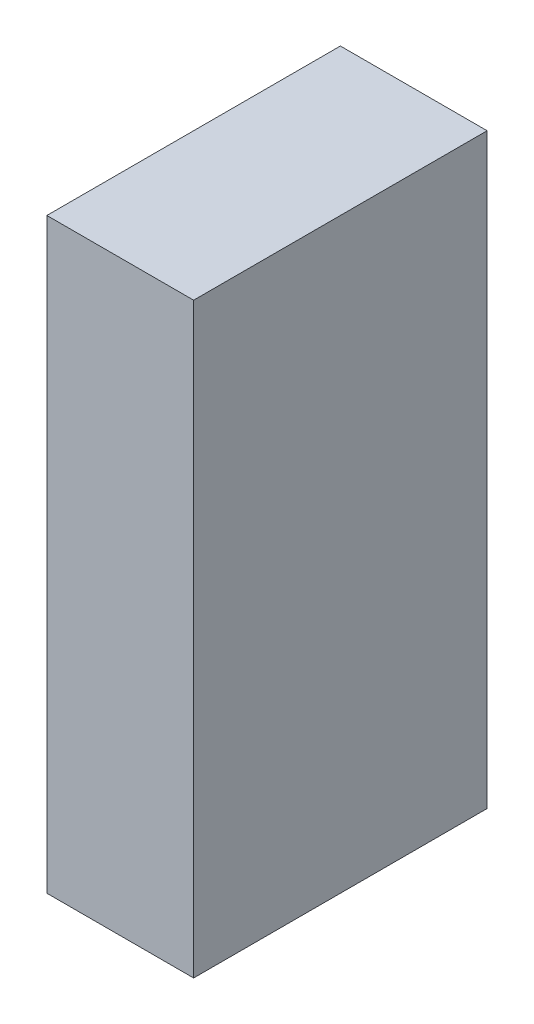
ISO-10303-21;
HEADER;
FILE_DESCRIPTION(('STEP AP214'),'2;1');
FILE_NAME('part.step','',(''),(''),'','','');
FILE_SCHEMA(('AUTOMOTIVE_DESIGN { 1 0 10303 214 1 1 1 1 }'));
ENDSEC;
DATA;
#1=APPLICATION_CONTEXT('core data for automotive mechanical design processes');
#2=APPLICATION_PROTOCOL_DEFINITION('international standard','automotive_design',2000,#1);
#3=PRODUCT_CONTEXT('',#1,'mechanical');
#4=PRODUCT('Part','Part','',(#3));
#5=PRODUCT_RELATED_PRODUCT_CATEGORY('part','',(#4));
#6=PRODUCT_DEFINITION_FORMATION('','',#4);
#7=PRODUCT_DEFINITION_CONTEXT('part definition',#1,'design');
#8=PRODUCT_DEFINITION('design','',#6,#7);
#9=PRODUCT_DEFINITION_SHAPE('','',#8);
#10=(LENGTH_UNIT() NAMED_UNIT(*) SI_UNIT(.MILLI.,.METRE.));
#11=(NAMED_UNIT(*) PLANE_ANGLE_UNIT() SI_UNIT($,.RADIAN.));
#12=(NAMED_UNIT(*) SI_UNIT($,.STERADIAN.) SOLID_ANGLE_UNIT());
#13=UNCERTAINTY_MEASURE_WITH_UNIT(LENGTH_MEASURE(1.E-05),#10,'distance_accuracy_value','');
#14=(GEOMETRIC_REPRESENTATION_CONTEXT(3) GLOBAL_UNCERTAINTY_ASSIGNED_CONTEXT((#13)) GLOBAL_UNIT_ASSIGNED_CONTEXT((#10,
#11,#12)) REPRESENTATION_CONTEXT('',''));
#15=CARTESIAN_POINT('',(0.,0.,0.));
#16=DIRECTION('',(0.,0.,1.));
#17=DIRECTION('',(1.,0.,0.));
#18=AXIS2_PLACEMENT_3D('',#15,#16,#17);
#19=CARTESIAN_POINT('',(10.,0.,0.));
#20=DIRECTION('',(0.,0.,1.));
#21=DIRECTION('',(1.,0.,0.));
#22=AXIS2_PLACEMENT_3D('',#19,#20,#21);
#23=PLANE('',#22);
#24=DIRECTION('',(0.,1.,0.));
#25=VECTOR('',#24,1.);
#26=CARTESIAN_POINT('',(0.,0.,0.));
#27=LINE('',#26,#25);
#28=CARTESIAN_POINT('',(0.,0.,0.));
#29=VERTEX_POINT('',#28);
#30=CARTESIAN_POINT('',(0.,40.,0.));
#31=VERTEX_POINT('',#30);
#32=EDGE_CURVE('E107',#29,#31,#27,.T.);
#33=ORIENTED_EDGE('',*,*,#32,.T.);
#34=DIRECTION('',(-1.,0.,0.));
#35=VECTOR('',#34,1.);
#36=CARTESIAN_POINT('',(10.,40.,0.));
#37=LINE('',#36,#35);
#38=CARTESIAN_POINT('',(10.,40.,0.));
#39=VERTEX_POINT('',#38);
#40=EDGE_CURVE('E11',#39,#31,#37,.T.);
#41=ORIENTED_EDGE('',*,*,#40,.F.);
#42=DIRECTION('',(0.,1.,0.));
#43=VECTOR('',#42,1.);
#44=CARTESIAN_POINT('',(10.,0.,0.));
#45=LINE('',#44,#43);
#46=CARTESIAN_POINT('',(10.,0.,0.));
#47=VERTEX_POINT('',#46);
#48=EDGE_CURVE('E92',#47,#39,#45,.T.);
#49=ORIENTED_EDGE('',*,*,#48,.F.);
#50=DIRECTION('',(-1.,0.,0.));
#51=VECTOR('',#50,1.);
#52=CARTESIAN_POINT('',(10.,0.,0.));
#53=LINE('',#52,#51);
#54=EDGE_CURVE('E105',#47,#29,#53,.T.);
#55=ORIENTED_EDGE('',*,*,#54,.T.);
#56=EDGE_LOOP('',(#33,#41,#49,#55));
#57=FACE_BOUND('',#56,.T.);
#58=ADVANCED_FACE('F43',(#57),#23,.F.);
#59=CARTESIAN_POINT('',(10.,40.,0.));
#60=DIRECTION('',(0.,-1.,0.));
#61=DIRECTION('',(0.,0.,-1.));
#62=AXIS2_PLACEMENT_3D('',#59,#60,#61);
#63=PLANE('',#62);
#64=DIRECTION('',(0.,0.,1.));
#65=VECTOR('',#64,1.);
#66=CARTESIAN_POINT('',(0.,40.,0.));
#67=LINE('',#66,#65);
#68=CARTESIAN_POINT('',(0.,40.,20.));
#69=VERTEX_POINT('',#68);
#70=EDGE_CURVE('E97',#31,#69,#67,.T.);
#71=ORIENTED_EDGE('',*,*,#70,.T.);
#72=DIRECTION('',(-1.,0.,0.));
#73=VECTOR('',#72,1.);
#74=CARTESIAN_POINT('',(10.,40.,20.));
#75=LINE('',#74,#73);
#76=CARTESIAN_POINT('',(10.,40.,20.));
#77=VERTEX_POINT('',#76);
#78=EDGE_CURVE('E51',#77,#69,#75,.T.);
#79=ORIENTED_EDGE('',*,*,#78,.F.);
#80=DIRECTION('',(0.,0.,1.));
#81=VECTOR('',#80,1.);
#82=CARTESIAN_POINT('',(10.,40.,0.));
#83=LINE('',#82,#81);
#84=EDGE_CURVE('E87',#39,#77,#83,.T.);
#85=ORIENTED_EDGE('',*,*,#84,.F.);
#86=ORIENTED_EDGE('',*,*,#40,.T.);
#87=EDGE_LOOP('',(#71,#79,#85,#86));
#88=FACE_BOUND('',#87,.T.);
#89=ADVANCED_FACE('F100',(#88),#63,.F.);
#90=CARTESIAN_POINT('',(10.,0.,20.));
#91=DIRECTION('',(0.,0.,-1.));
#92=DIRECTION('',(-1.,0.,0.));
#93=AXIS2_PLACEMENT_3D('',#90,#91,#92);
#94=PLANE('',#93);
#95=DIRECTION('',(0.,-1.,0.));
#96=VECTOR('',#95,1.);
#97=CARTESIAN_POINT('',(0.,0.,20.));
#98=LINE('',#97,#96);
#99=CARTESIAN_POINT('',(0.,0.,20.));
#100=VERTEX_POINT('',#99);
#101=EDGE_CURVE('E78',#69,#100,#98,.T.);
#102=ORIENTED_EDGE('',*,*,#101,.T.);
#103=DIRECTION('',(-1.,0.,0.));
#104=VECTOR('',#103,1.);
#105=CARTESIAN_POINT('',(10.,0.,20.));
#106=LINE('',#105,#104);
#107=CARTESIAN_POINT('',(10.,0.,20.));
#108=VERTEX_POINT('',#107);
#109=EDGE_CURVE('E98',#108,#100,#106,.T.);
#110=ORIENTED_EDGE('',*,*,#109,.F.);
#111=DIRECTION('',(0.,-1.,0.));
#112=VECTOR('',#111,1.);
#113=CARTESIAN_POINT('',(10.,0.,20.));
#114=LINE('',#113,#112);
#115=EDGE_CURVE('E95',#77,#108,#114,.T.);
#116=ORIENTED_EDGE('',*,*,#115,.F.);
#117=ORIENTED_EDGE('',*,*,#78,.T.);
#118=EDGE_LOOP('',(#102,#110,#116,#117));
#119=FACE_BOUND('',#118,.T.);
#120=ADVANCED_FACE('F99',(#119),#94,.F.);
#121=CARTESIAN_POINT('',(10.,0.,0.));
#122=DIRECTION('',(0.,1.,0.));
#123=DIRECTION('',(0.,0.,1.));
#124=AXIS2_PLACEMENT_3D('',#121,#122,#123);
#125=PLANE('',#124);
#126=DIRECTION('',(0.,0.,-1.));
#127=VECTOR('',#126,1.);
#128=CARTESIAN_POINT('',(0.,0.,0.));
#129=LINE('',#128,#127);
#130=EDGE_CURVE('E85',#100,#29,#129,.T.);
#131=ORIENTED_EDGE('',*,*,#130,.T.);
#132=ORIENTED_EDGE('',*,*,#54,.F.);
#133=DIRECTION('',(0.,0.,-1.));
#134=VECTOR('',#133,1.);
#135=CARTESIAN_POINT('',(10.,0.,0.));
#136=LINE('',#135,#134);
#137=EDGE_CURVE('E56',#108,#47,#136,.T.);
#138=ORIENTED_EDGE('',*,*,#137,.F.);
#139=ORIENTED_EDGE('',*,*,#109,.T.);
#140=EDGE_LOOP('',(#131,#132,#138,#139));
#141=FACE_BOUND('',#140,.T.);
#142=ADVANCED_FACE('F111',(#141),#125,.F.);
#143=CARTESIAN_POINT('',(10.,0.,0.));
#144=DIRECTION('',(1.,0.,0.));
#145=DIRECTION('',(0.,0.,-1.));
#146=AXIS2_PLACEMENT_3D('',#143,#144,#145);
#147=PLANE('',#146);
#148=ORIENTED_EDGE('',*,*,#48,.T.);
#149=ORIENTED_EDGE('',*,*,#84,.T.);
#150=ORIENTED_EDGE('',*,*,#115,.T.);
#151=ORIENTED_EDGE('',*,*,#137,.T.);
#152=EDGE_LOOP('',(#148,#149,#150,#151));
#153=FACE_BOUND('',#152,.T.);
#154=ADVANCED_FACE('F89',(#153),#147,.T.);
#155=CARTESIAN_POINT('',(0.,0.,0.));
#156=DIRECTION('',(1.,0.,0.));
#157=DIRECTION('',(0.,0.,-1.));
#158=AXIS2_PLACEMENT_3D('',#155,#156,#157);
#159=PLANE('',#158);
#160=ORIENTED_EDGE('',*,*,#32,.F.);
#161=ORIENTED_EDGE('',*,*,#130,.F.);
#162=ORIENTED_EDGE('',*,*,#101,.F.);
#163=ORIENTED_EDGE('',*,*,#70,.F.);
#164=EDGE_LOOP('',(#160,#161,#162,#163));
#165=FACE_BOUND('',#164,.T.);
#166=ADVANCED_FACE('F117',(#165),#159,.F.);
#167=CLOSED_SHELL('',(#58,#89,#120,#142,#154,#166));
#168=MANIFOLD_SOLID_BREP('B2',#167);
#169=ADVANCED_BREP_SHAPE_REPRESENTATION('',(#18,#168),#14);
#170=SHAPE_DEFINITION_REPRESENTATION(#9,#169);
ENDSEC;
END-ISO-10303-21;
